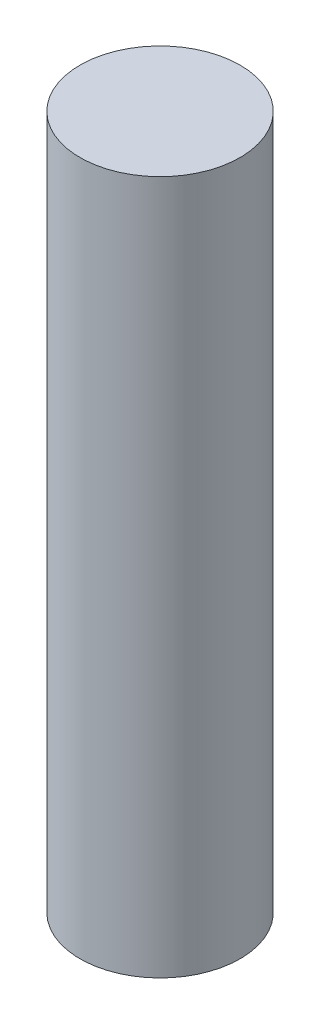
ISO-10303-21;
HEADER;
FILE_DESCRIPTION(('STEP AP214'),'2;1');
FILE_NAME('part.step','',(''),(''),'','','');
FILE_SCHEMA(('AUTOMOTIVE_DESIGN { 1 0 10303 214 1 1 1 1 }'));
ENDSEC;
DATA;
#1=APPLICATION_CONTEXT('core data for automotive mechanical design processes');
#2=APPLICATION_PROTOCOL_DEFINITION('international standard','automotive_design',2000,#1);
#3=PRODUCT_CONTEXT('',#1,'mechanical');
#4=PRODUCT('Part','Part','',(#3));
#5=PRODUCT_RELATED_PRODUCT_CATEGORY('part','',(#4));
#6=PRODUCT_DEFINITION_FORMATION('','',#4);
#7=PRODUCT_DEFINITION_CONTEXT('part definition',#1,'design');
#8=PRODUCT_DEFINITION('design','',#6,#7);
#9=PRODUCT_DEFINITION_SHAPE('','',#8);
#10=(LENGTH_UNIT() NAMED_UNIT(*) SI_UNIT(.MILLI.,.METRE.));
#11=(NAMED_UNIT(*) PLANE_ANGLE_UNIT() SI_UNIT($,.RADIAN.));
#12=(NAMED_UNIT(*) SI_UNIT($,.STERADIAN.) SOLID_ANGLE_UNIT());
#13=UNCERTAINTY_MEASURE_WITH_UNIT(LENGTH_MEASURE(1.E-05),#10,'distance_accuracy_value','');
#14=(GEOMETRIC_REPRESENTATION_CONTEXT(3) GLOBAL_UNCERTAINTY_ASSIGNED_CONTEXT((#13)) GLOBAL_UNIT_ASSIGNED_CONTEXT((#10,
#11,#12)) REPRESENTATION_CONTEXT('',''));
#15=CARTESIAN_POINT('',(0.,0.,0.));
#16=DIRECTION('',(0.,0.,1.));
#17=DIRECTION('',(1.,0.,0.));
#18=AXIS2_PLACEMENT_3D('',#15,#16,#17);
#19=CARTESIAN_POINT('',(0.,13.,0.));
#20=DIRECTION('',(0.,-1.,0.));
#21=DIRECTION('',(0.,0.,-1.));
#22=AXIS2_PLACEMENT_3D('',#19,#20,#21);
#23=CYLINDRICAL_SURFACE('',#22,1.5);
#24=CARTESIAN_POINT('',(0.,13.,0.));
#25=DIRECTION('',(0.,1.,0.));
#26=DIRECTION('',(0.,0.,1.));
#27=AXIS2_PLACEMENT_3D('',#24,#25,#26);
#28=CIRCLE('',#27,1.5);
#29=CARTESIAN_POINT('',(0.,13.,-1.5));
#30=VERTEX_POINT('',#29);
#31=EDGE_CURVE('E10',#30,#30,#28,.T.);
#32=CARTESIAN_POINT('',(0.,0.,0.));
#33=DIRECTION('',(0.,1.,0.));
#34=DIRECTION('',(0.,0.,1.));
#35=AXIS2_PLACEMENT_3D('',#32,#33,#34);
#36=CIRCLE('',#35,1.5);
#37=CARTESIAN_POINT('',(0.,0.,-1.5));
#38=VERTEX_POINT('',#37);
#39=EDGE_CURVE('E40',#38,#38,#36,.T.);
#40=CARTESIAN_POINT('',(0.,13.,-1.5));
#41=CARTESIAN_POINT('',(0.,12.8645833333333,-1.5));
#42=CARTESIAN_POINT('',(0.,12.7291666666667,-1.5));
#43=CARTESIAN_POINT('',(0.,12.4583333333333,-1.5));
#44=CARTESIAN_POINT('',(0.,12.3229166666667,-1.5));
#45=CARTESIAN_POINT('',(0.,12.0520833333333,-1.5));
#46=CARTESIAN_POINT('',(0.,11.9166666666667,-1.5));
#47=CARTESIAN_POINT('',(0.,11.6458333333333,-1.5));
#48=CARTESIAN_POINT('',(0.,11.5104166666667,-1.5));
#49=CARTESIAN_POINT('',(0.,11.2395833333333,-1.5));
#50=CARTESIAN_POINT('',(0.,11.1041666666667,-1.5));
#51=CARTESIAN_POINT('',(0.,10.8333333333333,-1.5));
#52=CARTESIAN_POINT('',(0.,10.6979166666667,-1.5));
#53=CARTESIAN_POINT('',(0.,10.4270833333333,-1.5));
#54=CARTESIAN_POINT('',(0.,10.2916666666667,-1.5));
#55=CARTESIAN_POINT('',(0.,10.0208333333333,-1.5));
#56=CARTESIAN_POINT('',(0.,9.88541666666667,-1.5));
#57=CARTESIAN_POINT('',(0.,9.61458333333333,-1.5));
#58=CARTESIAN_POINT('',(0.,9.47916666666667,-1.5));
#59=CARTESIAN_POINT('',(0.,9.20833333333333,-1.5));
#60=CARTESIAN_POINT('',(0.,9.07291666666666,-1.5));
#61=CARTESIAN_POINT('',(0.,8.80208333333333,-1.5));
#62=CARTESIAN_POINT('',(0.,8.66666666666667,-1.5));
#63=CARTESIAN_POINT('',(0.,8.39583333333333,-1.5));
#64=CARTESIAN_POINT('',(0.,8.26041666666667,-1.5));
#65=CARTESIAN_POINT('',(0.,7.98958333333333,-1.5));
#66=CARTESIAN_POINT('',(0.,7.85416666666667,-1.5));
#67=CARTESIAN_POINT('',(0.,7.58333333333333,-1.5));
#68=CARTESIAN_POINT('',(0.,7.44791666666667,-1.5));
#69=CARTESIAN_POINT('',(0.,7.17708333333333,-1.5));
#70=CARTESIAN_POINT('',(0.,7.04166666666667,-1.5));
#71=CARTESIAN_POINT('',(0.,6.77083333333333,-1.5));
#72=CARTESIAN_POINT('',(0.,6.63541666666667,-1.5));
#73=CARTESIAN_POINT('',(0.,6.36458333333333,-1.5));
#74=CARTESIAN_POINT('',(0.,6.22916666666667,-1.5));
#75=CARTESIAN_POINT('',(0.,5.95833333333333,-1.5));
#76=CARTESIAN_POINT('',(0.,5.82291666666667,-1.5));
#77=CARTESIAN_POINT('',(0.,5.55208333333333,-1.5));
#78=CARTESIAN_POINT('',(0.,5.41666666666667,-1.5));
#79=CARTESIAN_POINT('',(0.,5.14583333333333,-1.5));
#80=CARTESIAN_POINT('',(0.,5.01041666666667,-1.5));
#81=CARTESIAN_POINT('',(0.,4.73958333333333,-1.5));
#82=CARTESIAN_POINT('',(0.,4.60416666666667,-1.5));
#83=CARTESIAN_POINT('',(0.,4.33333333333333,-1.5));
#84=CARTESIAN_POINT('',(0.,4.19791666666667,-1.5));
#85=CARTESIAN_POINT('',(0.,3.92708333333333,-1.5));
#86=CARTESIAN_POINT('',(0.,3.79166666666667,-1.5));
#87=CARTESIAN_POINT('',(0.,3.52083333333333,-1.5));
#88=CARTESIAN_POINT('',(0.,3.38541666666667,-1.5));
#89=CARTESIAN_POINT('',(0.,3.11458333333333,-1.5));
#90=CARTESIAN_POINT('',(0.,2.97916666666667,-1.5));
#91=CARTESIAN_POINT('',(0.,2.70833333333333,-1.5));
#92=CARTESIAN_POINT('',(0.,2.57291666666667,-1.5));
#93=CARTESIAN_POINT('',(0.,2.30208333333333,-1.5));
#94=CARTESIAN_POINT('',(0.,2.16666666666667,-1.5));
#95=CARTESIAN_POINT('',(0.,1.89583333333333,-1.5));
#96=CARTESIAN_POINT('',(0.,1.76041666666667,-1.5));
#97=CARTESIAN_POINT('',(0.,1.48958333333333,-1.5));
#98=CARTESIAN_POINT('',(0.,1.35416666666667,-1.5));
#99=CARTESIAN_POINT('',(0.,1.08333333333333,-1.5));
#100=CARTESIAN_POINT('',(0.,0.947916666666667,-1.5));
#101=CARTESIAN_POINT('',(0.,0.677083333333334,-1.5));
#102=CARTESIAN_POINT('',(0.,0.541666666666667,-1.5));
#103=CARTESIAN_POINT('',(0.,0.270833333333334,-1.5));
#104=CARTESIAN_POINT('',(0.,0.135416666666667,-1.5));
#105=CARTESIAN_POINT('',(0.,0.,-1.5));
#106=B_SPLINE_CURVE_WITH_KNOTS('',3,(#40,#41,#42,#43,#44,#45,#46,#47,#48,#49,#50,#51,#52,#53,
#54,#55,#56,#57,#58,#59,#60,#61,#62,#63,#64,#65,#66,#67,#68,#69,#70,#71,#72,#73,#74,#75,#76,#77,
#78,#79,#80,#81,#82,#83,#84,#85,#86,#87,#88,#89,#90,#91,#92,#93,#94,#95,#96,#97,#98,#99,#100,
#101,#102,#103,#104,#105),.UNSPECIFIED.,.F.,.F.,(4,2,2,2,2,2,2,2,2,2,2,2,2,2,2,2,2,2,2,2,2,2,2,
2,2,2,2,2,2,2,2,2,4),(0.,0.40625,0.812500000000001,1.21875,1.625,2.03125,2.4375,2.84375,3.25,
3.65625,4.0625,4.46875,4.875,5.28125,5.6875,6.09375,6.5,6.90625,7.3125,7.71875,8.125,8.53125,
8.9375,9.34375,9.75,10.15625,10.5625,10.96875,11.375,11.78125,12.1875,12.59375,13.),.UNSPECIFIED.);
#107=EDGE_CURVE('BSEAM37',#30,#38,#106,.T.);
#108=ORIENTED_EDGE('',*,*,#31,.F.);
#109=ORIENTED_EDGE('',*,*,#39,.T.);
#110=ORIENTED_EDGE('',*,*,#107,.T.);
#111=ORIENTED_EDGE('',*,*,#107,.F.);
#112=EDGE_LOOP('',(#108,#110,#109,#111));
#113=FACE_BOUND('',#112,.T.);
#114=ADVANCED_FACE('F37',(#113),#23,.T.);
#115=CARTESIAN_POINT('',(0.,13.,0.));
#116=DIRECTION('',(0.,1.,0.));
#117=DIRECTION('',(0.,0.,1.));
#118=AXIS2_PLACEMENT_3D('',#115,#116,#117);
#119=PLANE('',#118);
#120=ORIENTED_EDGE('',*,*,#31,.T.);
#121=EDGE_LOOP('',(#120));
#122=FACE_BOUND('',#121,.T.);
#123=ADVANCED_FACE('F54',(#122),#119,.T.);
#124=CARTESIAN_POINT('',(0.,0.,0.));
#125=DIRECTION('',(0.,1.,0.));
#126=DIRECTION('',(0.,0.,1.));
#127=AXIS2_PLACEMENT_3D('',#124,#125,#126);
#128=PLANE('',#127);
#129=ORIENTED_EDGE('',*,*,#39,.F.);
#130=EDGE_LOOP('',(#129));
#131=FACE_BOUND('',#130,.T.);
#132=ADVANCED_FACE('F52',(#131),#128,.F.);
#133=CLOSED_SHELL('',(#114,#123,#132));
#134=MANIFOLD_SOLID_BREP('B2',#133);
#135=ADVANCED_BREP_SHAPE_REPRESENTATION('',(#18,#134),#14);
#136=SHAPE_DEFINITION_REPRESENTATION(#9,#135);
ENDSEC;
END-ISO-10303-21;
